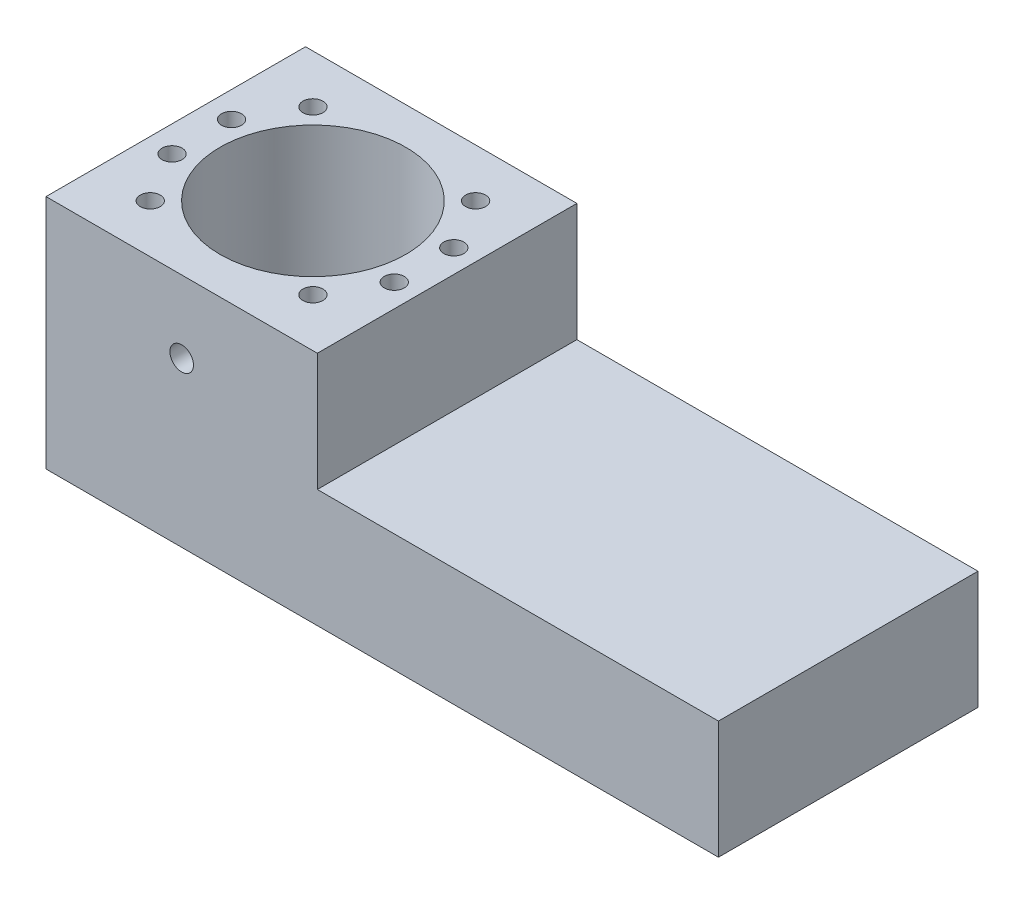
ISO-10303-21;
HEADER;
FILE_DESCRIPTION(('STEP AP214'),'2;1');
FILE_NAME('part.step','',(''),(''),'','','');
FILE_SCHEMA(('AUTOMOTIVE_DESIGN { 1 0 10303 214 1 1 1 1 }'));
ENDSEC;
DATA;
#1=APPLICATION_CONTEXT('core data for automotive mechanical design processes');
#2=APPLICATION_PROTOCOL_DEFINITION('international standard','automotive_design',2000,#1);
#3=PRODUCT_CONTEXT('',#1,'mechanical');
#4=PRODUCT('Part','Part','',(#3));
#5=PRODUCT_RELATED_PRODUCT_CATEGORY('part','',(#4));
#6=PRODUCT_DEFINITION_FORMATION('','',#4);
#7=PRODUCT_DEFINITION_CONTEXT('part definition',#1,'design');
#8=PRODUCT_DEFINITION('design','',#6,#7);
#9=PRODUCT_DEFINITION_SHAPE('','',#8);
#10=(LENGTH_UNIT() NAMED_UNIT(*) SI_UNIT(.MILLI.,.METRE.));
#11=(NAMED_UNIT(*) PLANE_ANGLE_UNIT() SI_UNIT($,.RADIAN.));
#12=(NAMED_UNIT(*) SI_UNIT($,.STERADIAN.) SOLID_ANGLE_UNIT());
#13=UNCERTAINTY_MEASURE_WITH_UNIT(LENGTH_MEASURE(1.E-05),#10,'distance_accuracy_value','');
#14=(GEOMETRIC_REPRESENTATION_CONTEXT(3) GLOBAL_UNCERTAINTY_ASSIGNED_CONTEXT((#13)) GLOBAL_UNIT_ASSIGNED_CONTEXT((#10,
#11,#12)) REPRESENTATION_CONTEXT('',''));
#15=CARTESIAN_POINT('',(0.,0.,0.));
#16=DIRECTION('',(0.,0.,1.));
#17=DIRECTION('',(1.,0.,0.));
#18=AXIS2_PLACEMENT_3D('',#15,#16,#17);
#19=CARTESIAN_POINT('',(0.,40.,0.));
#20=DIRECTION('',(0.,-1.,0.));
#21=DIRECTION('',(0.,0.,-1.));
#22=AXIS2_PLACEMENT_3D('',#19,#20,#21);
#23=PLANE('',#22);
#24=DIRECTION('',(0.,0.,-1.));
#25=VECTOR('',#24,1.);
#26=CARTESIAN_POINT('',(92.,40.,-88.));
#27=LINE('',#26,#25);
#28=CARTESIAN_POINT('',(92.,40.,0.));
#29=VERTEX_POINT('',#28);
#30=CARTESIAN_POINT('',(92.,40.,-88.));
#31=VERTEX_POINT('',#30);
#32=EDGE_CURVE('E69',#29,#31,#27,.T.);
#33=ORIENTED_EDGE('',*,*,#32,.F.);
#34=DIRECTION('',(1.,0.,0.));
#35=VECTOR('',#34,1.);
#36=CARTESIAN_POINT('',(0.,40.,0.));
#37=LINE('',#36,#35);
#38=CARTESIAN_POINT('',(228.,40.,0.));
#39=VERTEX_POINT('',#38);
#40=EDGE_CURVE('E107',#29,#39,#37,.T.);
#41=ORIENTED_EDGE('',*,*,#40,.T.);
#42=DIRECTION('',(0.,0.,-1.));
#43=VECTOR('',#42,1.);
#44=CARTESIAN_POINT('',(228.,40.,0.));
#45=LINE('',#44,#43);
#46=CARTESIAN_POINT('',(228.,40.,-88.));
#47=VERTEX_POINT('',#46);
#48=EDGE_CURVE('E75',#39,#47,#45,.T.);
#49=ORIENTED_EDGE('',*,*,#48,.T.);
#50=DIRECTION('',(-1.,0.,0.));
#51=VECTOR('',#50,1.);
#52=CARTESIAN_POINT('',(0.,40.,-88.));
#53=LINE('',#52,#51);
#54=EDGE_CURVE('E118',#47,#31,#53,.T.);
#55=ORIENTED_EDGE('',*,*,#54,.T.);
#56=EDGE_LOOP('',(#33,#41,#49,#55));
#57=FACE_BOUND('',#56,.T.);
#58=ADVANCED_FACE('F53',(#57),#23,.F.);
#59=CARTESIAN_POINT('',(0.,40.,0.));
#60=DIRECTION('',(1.,0.,0.));
#61=DIRECTION('',(0.,0.,-1.));
#62=AXIS2_PLACEMENT_3D('',#59,#60,#61);
#63=PLANE('',#62);
#64=DIRECTION('',(0.,0.,1.));
#65=VECTOR('',#64,1.);
#66=CARTESIAN_POINT('',(0.,0.,0.));
#67=LINE('',#66,#65);
#68=CARTESIAN_POINT('',(0.,0.,-88.));
#69=VERTEX_POINT('',#68);
#70=CARTESIAN_POINT('',(0.,0.,0.));
#71=VERTEX_POINT('',#70);
#72=EDGE_CURVE('E114',#69,#71,#67,.T.);
#73=ORIENTED_EDGE('',*,*,#72,.T.);
#74=DIRECTION('',(0.,-1.,0.));
#75=VECTOR('',#74,1.);
#76=CARTESIAN_POINT('',(0.,40.,0.));
#77=LINE('',#76,#75);
#78=CARTESIAN_POINT('',(0.,80.,0.));
#79=VERTEX_POINT('',#78);
#80=EDGE_CURVE('E11',#79,#71,#77,.T.);
#81=ORIENTED_EDGE('',*,*,#80,.F.);
#82=DIRECTION('',(0.,0.,1.));
#83=VECTOR('',#82,1.);
#84=CARTESIAN_POINT('',(0.,80.,-88.));
#85=LINE('',#84,#83);
#86=CARTESIAN_POINT('',(0.,80.,-88.));
#87=VERTEX_POINT('',#86);
#88=EDGE_CURVE('E116',#87,#79,#85,.T.);
#89=ORIENTED_EDGE('',*,*,#88,.F.);
#90=DIRECTION('',(0.,-1.,0.));
#91=VECTOR('',#90,1.);
#92=CARTESIAN_POINT('',(0.,40.,-88.));
#93=LINE('',#92,#91);
#94=EDGE_CURVE('E99',#87,#69,#93,.T.);
#95=ORIENTED_EDGE('',*,*,#94,.T.);
#96=EDGE_LOOP('',(#73,#81,#89,#95));
#97=FACE_BOUND('',#96,.T.);
#98=ADVANCED_FACE('F55',(#97),#63,.F.);
#99=CARTESIAN_POINT('',(0.,40.,0.));
#100=DIRECTION('',(0.,0.,-1.));
#101=DIRECTION('',(-1.,0.,0.));
#102=AXIS2_PLACEMENT_3D('',#99,#100,#101);
#103=PLANE('',#102);
#104=CARTESIAN_POINT('',(46.,55.4964910080931,0.));
#105=DIRECTION('',(0.,0.,1.));
#106=DIRECTION('',(1.,0.,0.));
#107=AXIS2_PLACEMENT_3D('',#104,#105,#106);
#108=CIRCLE('',#107,4.);
#109=CARTESIAN_POINT('',(50.,55.4964910080931,0.));
#110=VERTEX_POINT('',#109);
#111=EDGE_CURVE('E205',#110,#110,#108,.T.);
#112=ORIENTED_EDGE('',*,*,#111,.F.);
#113=EDGE_LOOP('',(#112));
#114=FACE_BOUND('',#113,.T.);
#115=DIRECTION('',(1.,0.,0.));
#116=VECTOR('',#115,1.);
#117=CARTESIAN_POINT('',(0.,0.,0.));
#118=LINE('',#117,#116);
#119=CARTESIAN_POINT('',(228.,0.,0.));
#120=VERTEX_POINT('',#119);
#121=EDGE_CURVE('E121',#71,#120,#118,.T.);
#122=ORIENTED_EDGE('',*,*,#121,.T.);
#123=DIRECTION('',(0.,-1.,0.));
#124=VECTOR('',#123,1.);
#125=CARTESIAN_POINT('',(228.,40.,0.));
#126=LINE('',#125,#124);
#127=EDGE_CURVE('E62',#39,#120,#126,.T.);
#128=ORIENTED_EDGE('',*,*,#127,.F.);
#129=ORIENTED_EDGE('',*,*,#40,.F.);
#130=DIRECTION('',(0.,-1.,0.));
#131=VECTOR('',#130,1.);
#132=CARTESIAN_POINT('',(92.,80.,0.));
#133=LINE('',#132,#131);
#134=CARTESIAN_POINT('',(92.,80.,0.));
#135=VERTEX_POINT('',#134);
#136=EDGE_CURVE('E123',#135,#29,#133,.T.);
#137=ORIENTED_EDGE('',*,*,#136,.F.);
#138=DIRECTION('',(1.,0.,0.));
#139=VECTOR('',#138,1.);
#140=CARTESIAN_POINT('',(0.,80.,0.));
#141=LINE('',#140,#139);
#142=EDGE_CURVE('E148',#79,#135,#141,.T.);
#143=ORIENTED_EDGE('',*,*,#142,.F.);
#144=ORIENTED_EDGE('',*,*,#80,.T.);
#145=EDGE_LOOP('',(#122,#128,#129,#137,#143,#144));
#146=FACE_BOUND('',#145,.T.);
#147=ADVANCED_FACE('F143',(#114,#146),#103,.F.);
#148=CARTESIAN_POINT('',(228.,40.,0.));
#149=DIRECTION('',(-1.,0.,0.));
#150=DIRECTION('',(0.,0.,1.));
#151=AXIS2_PLACEMENT_3D('',#148,#149,#150);
#152=PLANE('',#151);
#153=DIRECTION('',(0.,0.,-1.));
#154=VECTOR('',#153,1.);
#155=CARTESIAN_POINT('',(228.,0.,0.));
#156=LINE('',#155,#154);
#157=CARTESIAN_POINT('',(228.,0.,-88.));
#158=VERTEX_POINT('',#157);
#159=EDGE_CURVE('E108',#120,#158,#156,.T.);
#160=ORIENTED_EDGE('',*,*,#159,.T.);
#161=DIRECTION('',(0.,-1.,0.));
#162=VECTOR('',#161,1.);
#163=CARTESIAN_POINT('',(228.,40.,-88.));
#164=LINE('',#163,#162);
#165=EDGE_CURVE('E102',#47,#158,#164,.T.);
#166=ORIENTED_EDGE('',*,*,#165,.F.);
#167=ORIENTED_EDGE('',*,*,#48,.F.);
#168=ORIENTED_EDGE('',*,*,#127,.T.);
#169=EDGE_LOOP('',(#160,#166,#167,#168));
#170=FACE_BOUND('',#169,.T.);
#171=ADVANCED_FACE('F141',(#170),#152,.F.);
#172=CARTESIAN_POINT('',(0.,40.,-88.));
#173=DIRECTION('',(0.,0.,1.));
#174=DIRECTION('',(1.,0.,0.));
#175=AXIS2_PLACEMENT_3D('',#172,#173,#174);
#176=PLANE('',#175);
#177=DIRECTION('',(-1.,0.,0.));
#178=VECTOR('',#177,1.);
#179=CARTESIAN_POINT('',(0.,0.,-88.));
#180=LINE('',#179,#178);
#181=EDGE_CURVE('E95',#158,#69,#180,.T.);
#182=ORIENTED_EDGE('',*,*,#181,.T.);
#183=ORIENTED_EDGE('',*,*,#94,.F.);
#184=DIRECTION('',(-1.,0.,0.));
#185=VECTOR('',#184,1.);
#186=CARTESIAN_POINT('',(0.,80.,-88.));
#187=LINE('',#186,#185);
#188=CARTESIAN_POINT('',(92.,80.,-88.));
#189=VERTEX_POINT('',#188);
#190=EDGE_CURVE('E165',#189,#87,#187,.T.);
#191=ORIENTED_EDGE('',*,*,#190,.F.);
#192=DIRECTION('',(0.,-1.,0.));
#193=VECTOR('',#192,1.);
#194=CARTESIAN_POINT('',(92.,80.,-88.));
#195=LINE('',#194,#193);
#196=EDGE_CURVE('E129',#189,#31,#195,.T.);
#197=ORIENTED_EDGE('',*,*,#196,.T.);
#198=ORIENTED_EDGE('',*,*,#54,.F.);
#199=ORIENTED_EDGE('',*,*,#165,.T.);
#200=EDGE_LOOP('',(#182,#183,#191,#197,#198,#199));
#201=FACE_BOUND('',#200,.T.);
#202=ADVANCED_FACE('F97',(#201),#176,.F.);
#203=CARTESIAN_POINT('',(0.,0.,0.));
#204=DIRECTION('',(0.,-1.,0.));
#205=DIRECTION('',(0.,0.,-1.));
#206=AXIS2_PLACEMENT_3D('',#203,#204,#205);
#207=PLANE('',#206);
#208=CARTESIAN_POINT('',(46.5,0.,-44.));
#209=DIRECTION('',(0.,-1.,0.));
#210=DIRECTION('',(0.,0.,-1.));
#211=AXIS2_PLACEMENT_3D('',#208,#209,#210);
#212=CIRCLE('',#211,31.5);
#213=CARTESIAN_POINT('',(46.5,0.,-75.5));
#214=VERTEX_POINT('',#213);
#215=EDGE_CURVE('E283',#214,#214,#212,.F.);
#216=ORIENTED_EDGE('',*,*,#215,.T.);
#217=EDGE_LOOP('',(#216));
#218=FACE_BOUND('',#217,.T.);
#219=ORIENTED_EDGE('',*,*,#72,.F.);
#220=ORIENTED_EDGE('',*,*,#181,.F.);
#221=ORIENTED_EDGE('',*,*,#159,.F.);
#222=ORIENTED_EDGE('',*,*,#121,.F.);
#223=EDGE_LOOP('',(#219,#220,#221,#222));
#224=FACE_BOUND('',#223,.T.);
#225=ADVANCED_FACE('F120',(#218,#224),#207,.T.);
#226=CARTESIAN_POINT('',(92.,80.,-88.));
#227=DIRECTION('',(-1.,0.,0.));
#228=DIRECTION('',(0.,0.,1.));
#229=AXIS2_PLACEMENT_3D('',#226,#227,#228);
#230=PLANE('',#229);
#231=ORIENTED_EDGE('',*,*,#32,.T.);
#232=ORIENTED_EDGE('',*,*,#196,.F.);
#233=DIRECTION('',(0.,0.,-1.));
#234=VECTOR('',#233,1.);
#235=CARTESIAN_POINT('',(92.,80.,-88.));
#236=LINE('',#235,#234);
#237=EDGE_CURVE('E162',#135,#189,#236,.T.);
#238=ORIENTED_EDGE('',*,*,#237,.F.);
#239=ORIENTED_EDGE('',*,*,#136,.T.);
#240=EDGE_LOOP('',(#231,#232,#238,#239));
#241=FACE_BOUND('',#240,.T.);
#242=ADVANCED_FACE('F170',(#241),#230,.F.);
#243=CARTESIAN_POINT('',(0.,80.,0.));
#244=DIRECTION('',(0.,1.,0.));
#245=DIRECTION('',(0.,0.,1.));
#246=AXIS2_PLACEMENT_3D('',#243,#244,#245);
#247=PLANE('',#246);
#248=CARTESIAN_POINT('',(18.9228355337245,80.,-71.5771644662752));
#249=DIRECTION('',(0.,1.,0.));
#250=DIRECTION('',(0.,0.,1.));
#251=AXIS2_PLACEMENT_3D('',#248,#249,#250);
#252=CIRCLE('',#251,3.39999999999999);
#253=CARTESIAN_POINT('',(18.9228355337245,80.,-68.1771644662752));
#254=VERTEX_POINT('',#253);
#255=EDGE_CURVE('E208',#254,#254,#252,.T.);
#256=ORIENTED_EDGE('',*,*,#255,.F.);
#257=EDGE_LOOP('',(#256));
#258=FACE_BOUND('',#257,.T.);
#259=CARTESIAN_POINT('',(8.82889277472635,80.,-54.0939427589983));
#260=DIRECTION('',(0.,1.,0.));
#261=DIRECTION('',(0.,0.,1.));
#262=AXIS2_PLACEMENT_3D('',#259,#260,#261);
#263=CIRCLE('',#262,3.39999999999999);
#264=CARTESIAN_POINT('',(8.82889277472635,80.,-50.6939427589983));
#265=VERTEX_POINT('',#264);
#266=EDGE_CURVE('E227',#265,#265,#263,.T.);
#267=ORIENTED_EDGE('',*,*,#266,.F.);
#268=EDGE_LOOP('',(#267));
#269=FACE_BOUND('',#268,.T.);
#270=CARTESIAN_POINT('',(8.82889277472628,80.,-33.9060572410019));
#271=DIRECTION('',(0.,1.,0.));
#272=DIRECTION('',(0.,0.,1.));
#273=AXIS2_PLACEMENT_3D('',#270,#271,#272);
#274=CIRCLE('',#273,3.39999999999999);
#275=CARTESIAN_POINT('',(8.82889277472628,80.,-30.5060572410019));
#276=VERTEX_POINT('',#275);
#277=EDGE_CURVE('E235',#276,#276,#274,.T.);
#278=ORIENTED_EDGE('',*,*,#277,.F.);
#279=EDGE_LOOP('',(#278));
#280=FACE_BOUND('',#279,.T.);
#281=CARTESIAN_POINT('',(18.9228355337245,80.,-16.4228355337248));
#282=DIRECTION('',(0.,1.,0.));
#283=DIRECTION('',(0.,0.,1.));
#284=AXIS2_PLACEMENT_3D('',#281,#282,#283);
#285=CIRCLE('',#284,3.39999999999999);
#286=CARTESIAN_POINT('',(18.9228355337245,80.,-13.0228355337248));
#287=VERTEX_POINT('',#286);
#288=EDGE_CURVE('E243',#287,#287,#285,.T.);
#289=ORIENTED_EDGE('',*,*,#288,.F.);
#290=EDGE_LOOP('',(#289));
#291=FACE_BOUND('',#290,.T.);
#292=CARTESIAN_POINT('',(74.0771644662755,80.,-16.4228355337248));
#293=DIRECTION('',(0.,1.,0.));
#294=DIRECTION('',(0.,0.,1.));
#295=AXIS2_PLACEMENT_3D('',#292,#293,#294);
#296=CIRCLE('',#295,3.39999999999999);
#297=CARTESIAN_POINT('',(74.0771644662755,80.,-13.0228355337248));
#298=VERTEX_POINT('',#297);
#299=EDGE_CURVE('E251',#298,#298,#296,.T.);
#300=ORIENTED_EDGE('',*,*,#299,.F.);
#301=EDGE_LOOP('',(#300));
#302=FACE_BOUND('',#301,.T.);
#303=CARTESIAN_POINT('',(84.1711072252737,80.,-54.0939427589983));
#304=DIRECTION('',(0.,1.,0.));
#305=DIRECTION('',(0.,0.,1.));
#306=AXIS2_PLACEMENT_3D('',#303,#304,#305);
#307=CIRCLE('',#306,3.39999999999999);
#308=CARTESIAN_POINT('',(84.1711072252737,80.,-50.6939427589983));
#309=VERTEX_POINT('',#308);
#310=EDGE_CURVE('E259',#309,#309,#307,.T.);
#311=ORIENTED_EDGE('',*,*,#310,.F.);
#312=EDGE_LOOP('',(#311));
#313=FACE_BOUND('',#312,.T.);
#314=CARTESIAN_POINT('',(84.1711072252737,80.,-33.9060572410019));
#315=DIRECTION('',(0.,1.,0.));
#316=DIRECTION('',(0.,0.,1.));
#317=AXIS2_PLACEMENT_3D('',#314,#315,#316);
#318=CIRCLE('',#317,3.39999999999999);
#319=CARTESIAN_POINT('',(84.1711072252737,80.,-30.5060572410019));
#320=VERTEX_POINT('',#319);
#321=EDGE_CURVE('E267',#320,#320,#318,.T.);
#322=ORIENTED_EDGE('',*,*,#321,.F.);
#323=EDGE_LOOP('',(#322));
#324=FACE_BOUND('',#323,.T.);
#325=CARTESIAN_POINT('',(74.0771644662755,80.,-71.5771644662752));
#326=DIRECTION('',(0.,1.,0.));
#327=DIRECTION('',(0.,0.,1.));
#328=AXIS2_PLACEMENT_3D('',#325,#326,#327);
#329=CIRCLE('',#328,3.39999999999999);
#330=CARTESIAN_POINT('',(74.0771644662755,80.,-68.1771644662752));
#331=VERTEX_POINT('',#330);
#332=EDGE_CURVE('E275',#331,#331,#329,.T.);
#333=ORIENTED_EDGE('',*,*,#332,.F.);
#334=EDGE_LOOP('',(#333));
#335=FACE_BOUND('',#334,.T.);
#336=CARTESIAN_POINT('',(46.5,80.,-44.));
#337=DIRECTION('',(0.,1.,0.));
#338=DIRECTION('',(0.,0.,1.));
#339=AXIS2_PLACEMENT_3D('',#336,#337,#338);
#340=CIRCLE('',#339,31.5);
#341=CARTESIAN_POINT('',(46.5,80.,-12.5));
#342=VERTEX_POINT('',#341);
#343=EDGE_CURVE('E178',#342,#342,#340,.T.);
#344=ORIENTED_EDGE('',*,*,#343,.F.);
#345=EDGE_LOOP('',(#344));
#346=FACE_BOUND('',#345,.T.);
#347=ORIENTED_EDGE('',*,*,#88,.T.);
#348=ORIENTED_EDGE('',*,*,#142,.T.);
#349=ORIENTED_EDGE('',*,*,#237,.T.);
#350=ORIENTED_EDGE('',*,*,#190,.T.);
#351=EDGE_LOOP('',(#347,#348,#349,#350));
#352=FACE_BOUND('',#351,.T.);
#353=ADVANCED_FACE('F164',(#258,#269,#280,#291,#302,#313,#324,#335,#346,#352),#247,.T.);
#354=CARTESIAN_POINT('',(46.5,-0.001000000000001,-44.));
#355=DIRECTION('',(0.,1.,0.));
#356=DIRECTION('',(0.,0.,1.));
#357=AXIS2_PLACEMENT_3D('',#354,#355,#356);
#358=CYLINDRICAL_SURFACE('',#357,31.5);
#359=CARTESIAN_POINT('',(50.,55.4964910080931,-12.6950483150029));
#360=CARTESIAN_POINT('',(49.9999905526214,55.2725134643701,-12.6950452182688));
#361=CARTESIAN_POINT('',(49.9811249309432,55.0483968328891,-12.6929201998589));
#362=CARTESIAN_POINT('',(49.9061589237522,54.6063947805882,-12.6846770916041));
#363=CARTESIAN_POINT('',(49.8500198619527,54.3885160776873,-12.6785548542082));
#364=CARTESIAN_POINT('',(49.7021698560303,53.9654451910184,-12.6630952637477));
#365=CARTESIAN_POINT('',(49.610481283404,53.7602451224871,-12.6537599331138));
#366=CARTESIAN_POINT('',(49.3941736577313,53.3681788137096,-12.6330507119794));
#367=CARTESIAN_POINT('',(49.2695603817368,53.1813093650064,-12.6216771792195));
#368=CARTESIAN_POINT('',(48.9903258728378,52.8303249548772,-12.5982814346249));
#369=CARTESIAN_POINT('',(48.835585421737,52.66630498827,-12.5862567873782));
#370=CARTESIAN_POINT('',(48.5007394484845,52.3665061512053,-12.5631562093556));
#371=CARTESIAN_POINT('',(48.3206329056692,52.2307284176843,-12.5520803167839));
#372=CARTESIAN_POINT('',(47.9397484491421,51.9910534936037,-12.5323420149));
#373=CARTESIAN_POINT('',(47.7389342327172,51.8872136071653,-12.5236839462729));
#374=CARTESIAN_POINT('',(47.3225949024218,51.7147576963311,-12.5100544715113));
#375=CARTESIAN_POINT('',(47.1070703932273,51.6461402250822,-12.50508291394));
#376=CARTESIAN_POINT('',(46.6687176640996,51.546420113928,-12.4996938176341));
#377=CARTESIAN_POINT('',(46.4459367547901,51.5151108636889,-12.4992510939941));
#378=CARTESIAN_POINT('',(45.998324678323,51.4902161912952,-12.5032001072926));
#379=CARTESIAN_POINT('',(45.7734935767528,51.4966295665601,-12.5075916901118));
#380=CARTESIAN_POINT('',(45.32916739846,51.5468377754367,-12.5209853836314));
#381=CARTESIAN_POINT('',(45.1096536462226,51.5904729827294,-12.5299677408946));
#382=CARTESIAN_POINT('',(44.6811289572067,51.7135976348924,-12.551824054253));
#383=CARTESIAN_POINT('',(44.472118339847,51.7930881694537,-12.5646981286187));
#384=CARTESIAN_POINT('',(44.0694674156033,51.9860618590479,-12.5932574770662));
#385=CARTESIAN_POINT('',(43.8759011686966,52.0996976457437,-12.6089552440715));
#386=CARTESIAN_POINT('',(43.510517746574,52.3576229980031,-12.6416407155006));
#387=CARTESIAN_POINT('',(43.3387017055665,52.5019141611031,-12.6586284871205));
#388=CARTESIAN_POINT('',(43.0203495091137,52.8183524958156,-12.6923667203972));
#389=CARTESIAN_POINT('',(42.8740120663182,52.9906999626945,-12.7091144563983));
#390=CARTESIAN_POINT('',(42.612334359207,53.3576811974703,-12.7405457363362));
#391=CARTESIAN_POINT('',(42.4969939694182,53.55231487515,-12.7552292886283));
#392=CARTESIAN_POINT('',(42.3007400042504,53.9582306179323,-12.780998555443));
#393=CARTESIAN_POINT('',(42.2197941324777,54.1694968431189,-12.7920876428308));
#394=CARTESIAN_POINT('',(42.0945929746721,54.6028198533479,-12.8095139100407));
#395=CARTESIAN_POINT('',(42.0503353663374,54.8248759544682,-12.8158513906286));
#396=CARTESIAN_POINT('',(42.000084509239,55.2713452884554,-12.8230628630101));
#397=CARTESIAN_POINT('',(41.9937521613076,55.4957196076113,-12.8239852708361));
#398=CARTESIAN_POINT('',(42.0186375718385,55.9423267016635,-12.8203986083807));
#399=CARTESIAN_POINT('',(42.0498542963398,56.1645595353584,-12.8158896876576));
#400=CARTESIAN_POINT('',(42.1486808725387,56.5996218858442,-12.8019476603474));
#401=CARTESIAN_POINT('',(42.2161370100331,56.8124870405947,-12.7925353571688));
#402=CARTESIAN_POINT('',(42.3853634876833,57.2238820878671,-12.7697740531702));
#403=CARTESIAN_POINT('',(42.4871352575761,57.4224113826768,-12.7564248883263));
#404=CARTESIAN_POINT('',(42.7228817907666,57.8009528511829,-12.7270479725938));
#405=CARTESIAN_POINT('',(42.8570663285344,57.9808330207146,-12.7110029892939));
#406=CARTESIAN_POINT('',(43.1535204604882,58.3156317557635,-12.6779109077624));
#407=CARTESIAN_POINT('',(43.3157915191141,58.4705490188934,-12.6608637573081));
#408=CARTESIAN_POINT('',(43.6653358729297,58.7522741506609,-12.627309818171));
#409=CARTESIAN_POINT('',(43.852796592093,58.8788502408813,-12.6108083634729));
#410=CARTESIAN_POINT('',(44.2464898023805,59.0987171866047,-12.5800919281779));
#411=CARTESIAN_POINT('',(44.4527220539545,59.1920084667922,-12.5658769184092));
#412=CARTESIAN_POINT('',(44.8777762559714,59.3424429616687,-12.5410808779646));
#413=CARTESIAN_POINT('',(45.0965752887391,59.3996498333628,-12.5304934629615));
#414=CARTESIAN_POINT('',(45.5408439035196,59.4764390286685,-12.513822028548));
#415=CARTESIAN_POINT('',(45.7663131437518,59.4960232766797,-12.5077377788103));
#416=CARTESIAN_POINT('',(46.215621059676,59.4969385368491,-12.5004885908913));
#417=CARTESIAN_POINT('',(46.4394585432951,59.4785705665454,-12.4992851648802));
#418=CARTESIAN_POINT('',(46.8808921563182,59.4047013068041,-12.5015293210905));
#419=CARTESIAN_POINT('',(47.0984883591206,59.3492004542421,-12.5049768485929));
#420=CARTESIAN_POINT('',(47.5207863101442,59.2028423791761,-12.515836513415));
#421=CARTESIAN_POINT('',(47.7255157498168,59.1120643338178,-12.5232397862013));
#422=CARTESIAN_POINT('',(48.1168962068975,58.8977453384345,-12.54091435239));
#423=CARTESIAN_POINT('',(48.3035471301131,58.7742042177199,-12.5511856607344));
#424=CARTESIAN_POINT('',(48.6546071693469,58.4970504531657,-12.57327842807));
#425=CARTESIAN_POINT('',(48.8188856727676,58.343273041252,-12.5851082578919));
#426=CARTESIAN_POINT('',(49.1194256460127,58.010348739124,-12.6087369374011));
#427=CARTESIAN_POINT('',(49.2556804379094,57.8311958191728,-12.6205357790442));
#428=CARTESIAN_POINT('',(49.496856535434,57.4516866182564,-12.6426463297995));
#429=CARTESIAN_POINT('',(49.6016320377496,57.2512373215034,-12.652951007871));
#430=CARTESIAN_POINT('',(49.7759057910828,56.8355992086745,-12.6706817467005));
#431=CARTESIAN_POINT('',(49.8454417195595,56.6204264153435,-12.6781108799175));
#432=CARTESIAN_POINT('',(49.9307813948671,56.252889382183,-12.6873687861393));
#433=CARTESIAN_POINT('',(49.9567012698074,56.1028210919076,-12.690232784254));
#434=CARTESIAN_POINT('',(49.9913137285959,55.8006869179542,-12.6940735946492));
#435=CARTESIAN_POINT('',(50.000006416849,55.6486210463881,-12.6950504183668));
#436=CARTESIAN_POINT('',(50.,55.4964910080931,-12.6950483150029));
#437=B_SPLINE_CURVE_WITH_KNOTS('',3,(#359,#360,#361,#362,#363,#364,#365,#366,#367,#368,#369,
#370,#371,#372,#373,#374,#375,#376,#377,#378,#379,#380,#381,#382,#383,#384,#385,#386,#387,#388,
#389,#390,#391,#392,#393,#394,#395,#396,#397,#398,#399,#400,#401,#402,#403,#404,#405,#406,#407,
#408,#409,#410,#411,#412,#413,#414,#415,#416,#417,#418,#419,#420,#421,#422,#423,#424,#425,#426,
#427,#428,#429,#430,#431,#432,#433,#434,#435,#436),.UNSPECIFIED.,.T.,.F.,(4,2,2,2,2,2,2,2,2,2,2,
2,2,2,2,2,2,2,2,2,2,2,2,2,2,2,2,2,2,2,2,2,2,2,2,2,2,2,4),(0.,0.671377595071049,1.34345292714408,
2.01510600331093,2.6866413076985,3.36089007639694,4.03516598281296,4.71064473700618,
5.38609574191924,6.05778849924319,6.72945984341711,7.39826511454233,8.06709071291595,
8.73895164559038,9.41084759938919,10.0877694779732,10.7646886164019,11.4409707166747,
12.1172100062243,12.7873937365306,13.4575590129077,14.1249038834842,14.792276561958,
15.4640899765285,16.1359384302175,16.8130954939901,17.4902439175317,18.1661944084293,
18.8421103234923,19.5126858040352,20.1832533952639,20.8523245577611,21.5213992060655,
22.1942263118651,22.8672135641258,23.5432714848814,24.218605044709,24.6746209316293,
25.1306340548687),.UNSPECIFIED.);
#438=CARTESIAN_POINT('',(50.,55.4964910080931,-12.6950483150029));
#439=VERTEX_POINT('',#438);
#440=EDGE_CURVE('E209',#439,#439,#437,.T.);
#441=ORIENTED_EDGE('',*,*,#440,.F.);
#442=EDGE_LOOP('',(#441));
#443=FACE_BOUND('',#442,.T.);
#444=ORIENTED_EDGE('',*,*,#215,.F.);
#445=EDGE_LOOP('',(#444));
#446=FACE_BOUND('',#445,.T.);
#447=ORIENTED_EDGE('',*,*,#343,.T.);
#448=EDGE_LOOP('',(#447));
#449=FACE_BOUND('',#448,.T.);
#450=ADVANCED_FACE('F294',(#443,#446,#449),#358,.F.);
#451=CARTESIAN_POINT('',(74.0771644662755,50.,-71.5771644662752));
#452=DIRECTION('',(0.,1.,0.));
#453=DIRECTION('',(0.,0.,1.));
#454=AXIS2_PLACEMENT_3D('',#451,#452,#453);
#455=CONICAL_SURFACE('',#454,3.4,1.02974425867665);
#456=CARTESIAN_POINT('',(74.0771644662755,47.9570738953063,-71.5771644662752));
#457=VERTEX_POINT('',#456);
#458=VERTEX_LOOP('',#457);
#459=FACE_BOUND('',#458,.T.);
#460=CARTESIAN_POINT('',(74.0771644662755,50.,-71.5771644662752));
#461=DIRECTION('',(0.,1.,0.));
#462=DIRECTION('',(0.,0.,1.));
#463=AXIS2_PLACEMENT_3D('',#460,#461,#462);
#464=CIRCLE('',#463,3.4);
#465=CARTESIAN_POINT('',(74.0771644662755,50.,-68.1771644662752));
#466=VERTEX_POINT('',#465);
#467=EDGE_CURVE('E279',#466,#466,#464,.T.);
#468=ORIENTED_EDGE('',*,*,#467,.T.);
#469=EDGE_LOOP('',(#468));
#470=FACE_BOUND('',#469,.T.);
#471=ADVANCED_FACE('F296',(#459,#470),#455,.F.);
#472=CARTESIAN_POINT('',(74.0771644662755,80.,-71.5771644662752));
#473=DIRECTION('',(0.,1.,0.));
#474=DIRECTION('',(0.,0.,1.));
#475=AXIS2_PLACEMENT_3D('',#472,#473,#474);
#476=CYLINDRICAL_SURFACE('',#475,3.39999999999999);
#477=ORIENTED_EDGE('',*,*,#467,.F.);
#478=EDGE_LOOP('',(#477));
#479=FACE_BOUND('',#478,.T.);
#480=ORIENTED_EDGE('',*,*,#332,.T.);
#481=EDGE_LOOP('',(#480));
#482=FACE_BOUND('',#481,.T.);
#483=ADVANCED_FACE('F311',(#479,#482),#476,.F.);
#484=CARTESIAN_POINT('',(84.1711072252737,50.,-33.9060572410019));
#485=DIRECTION('',(0.,1.,0.));
#486=DIRECTION('',(0.,0.,1.));
#487=AXIS2_PLACEMENT_3D('',#484,#485,#486);
#488=CONICAL_SURFACE('',#487,3.4,1.02974425867665);
#489=CARTESIAN_POINT('',(84.1711072252737,47.9570738953063,-33.9060572410019));
#490=VERTEX_POINT('',#489);
#491=VERTEX_LOOP('',#490);
#492=FACE_BOUND('',#491,.T.);
#493=CARTESIAN_POINT('',(84.1711072252737,50.,-33.9060572410019));
#494=DIRECTION('',(0.,1.,0.));
#495=DIRECTION('',(0.,0.,1.));
#496=AXIS2_PLACEMENT_3D('',#493,#494,#495);
#497=CIRCLE('',#496,3.4);
#498=CARTESIAN_POINT('',(84.1711072252737,50.,-30.5060572410019));
#499=VERTEX_POINT('',#498);
#500=EDGE_CURVE('E271',#499,#499,#497,.T.);
#501=ORIENTED_EDGE('',*,*,#500,.T.);
#502=EDGE_LOOP('',(#501));
#503=FACE_BOUND('',#502,.T.);
#504=ADVANCED_FACE('F315',(#492,#503),#488,.F.);
#505=CARTESIAN_POINT('',(84.1711072252737,80.,-33.9060572410019));
#506=DIRECTION('',(0.,1.,0.));
#507=DIRECTION('',(0.,0.,1.));
#508=AXIS2_PLACEMENT_3D('',#505,#506,#507);
#509=CYLINDRICAL_SURFACE('',#508,3.39999999999999);
#510=ORIENTED_EDGE('',*,*,#500,.F.);
#511=EDGE_LOOP('',(#510));
#512=FACE_BOUND('',#511,.T.);
#513=ORIENTED_EDGE('',*,*,#321,.T.);
#514=EDGE_LOOP('',(#513));
#515=FACE_BOUND('',#514,.T.);
#516=ADVANCED_FACE('F319',(#512,#515),#509,.F.);
#517=CARTESIAN_POINT('',(84.1711072252737,50.,-54.0939427589983));
#518=DIRECTION('',(0.,1.,0.));
#519=DIRECTION('',(0.,0.,1.));
#520=AXIS2_PLACEMENT_3D('',#517,#518,#519);
#521=CONICAL_SURFACE('',#520,3.39999999999999,1.02974425867665);
#522=CARTESIAN_POINT('',(84.1711072252736,47.9570738953063,-54.0939427589983));
#523=VERTEX_POINT('',#522);
#524=VERTEX_LOOP('',#523);
#525=FACE_BOUND('',#524,.T.);
#526=CARTESIAN_POINT('',(84.1711072252737,50.,-54.0939427589983));
#527=DIRECTION('',(0.,1.,0.));
#528=DIRECTION('',(0.,0.,1.));
#529=AXIS2_PLACEMENT_3D('',#526,#527,#528);
#530=CIRCLE('',#529,3.39999999999999);
#531=CARTESIAN_POINT('',(84.1711072252737,50.,-50.6939427589983));
#532=VERTEX_POINT('',#531);
#533=EDGE_CURVE('E263',#532,#532,#530,.T.);
#534=ORIENTED_EDGE('',*,*,#533,.T.);
#535=EDGE_LOOP('',(#534));
#536=FACE_BOUND('',#535,.T.);
#537=ADVANCED_FACE('F323',(#525,#536),#521,.F.);
#538=CARTESIAN_POINT('',(84.1711072252737,80.,-54.0939427589983));
#539=DIRECTION('',(0.,1.,0.));
#540=DIRECTION('',(0.,0.,1.));
#541=AXIS2_PLACEMENT_3D('',#538,#539,#540);
#542=CYLINDRICAL_SURFACE('',#541,3.39999999999999);
#543=ORIENTED_EDGE('',*,*,#533,.F.);
#544=EDGE_LOOP('',(#543));
#545=FACE_BOUND('',#544,.T.);
#546=ORIENTED_EDGE('',*,*,#310,.T.);
#547=EDGE_LOOP('',(#546));
#548=FACE_BOUND('',#547,.T.);
#549=ADVANCED_FACE('F327',(#545,#548),#542,.F.);
#550=CARTESIAN_POINT('',(74.0771644662755,50.,-16.4228355337248));
#551=DIRECTION('',(0.,1.,0.));
#552=DIRECTION('',(0.,0.,1.));
#553=AXIS2_PLACEMENT_3D('',#550,#551,#552);
#554=CONICAL_SURFACE('',#553,3.39999999999999,1.02974425867665);
#555=CARTESIAN_POINT('',(74.0771644662755,47.9570738953063,-16.4228355337248));
#556=VERTEX_POINT('',#555);
#557=VERTEX_LOOP('',#556);
#558=FACE_BOUND('',#557,.T.);
#559=CARTESIAN_POINT('',(74.0771644662755,50.,-16.4228355337248));
#560=DIRECTION('',(0.,1.,0.));
#561=DIRECTION('',(0.,0.,1.));
#562=AXIS2_PLACEMENT_3D('',#559,#560,#561);
#563=CIRCLE('',#562,3.39999999999999);
#564=CARTESIAN_POINT('',(74.0771644662755,50.,-13.0228355337248));
#565=VERTEX_POINT('',#564);
#566=EDGE_CURVE('E255',#565,#565,#563,.T.);
#567=ORIENTED_EDGE('',*,*,#566,.T.);
#568=EDGE_LOOP('',(#567));
#569=FACE_BOUND('',#568,.T.);
#570=ADVANCED_FACE('F331',(#558,#569),#554,.F.);
#571=CARTESIAN_POINT('',(74.0771644662755,80.,-16.4228355337248));
#572=DIRECTION('',(0.,1.,0.));
#573=DIRECTION('',(0.,0.,1.));
#574=AXIS2_PLACEMENT_3D('',#571,#572,#573);
#575=CYLINDRICAL_SURFACE('',#574,3.39999999999999);
#576=ORIENTED_EDGE('',*,*,#566,.F.);
#577=EDGE_LOOP('',(#576));
#578=FACE_BOUND('',#577,.T.);
#579=ORIENTED_EDGE('',*,*,#299,.T.);
#580=EDGE_LOOP('',(#579));
#581=FACE_BOUND('',#580,.T.);
#582=ADVANCED_FACE('F335',(#578,#581),#575,.F.);
#583=CARTESIAN_POINT('',(18.9228355337245,50.,-16.4228355337248));
#584=DIRECTION('',(0.,1.,0.));
#585=DIRECTION('',(0.,0.,1.));
#586=AXIS2_PLACEMENT_3D('',#583,#584,#585);
#587=CONICAL_SURFACE('',#586,3.39999999999999,1.02974425867665);
#588=CARTESIAN_POINT('',(18.9228355337245,47.9570738953063,-16.4228355337248));
#589=VERTEX_POINT('',#588);
#590=VERTEX_LOOP('',#589);
#591=FACE_BOUND('',#590,.T.);
#592=CARTESIAN_POINT('',(18.9228355337245,50.,-16.4228355337248));
#593=DIRECTION('',(0.,1.,0.));
#594=DIRECTION('',(0.,0.,1.));
#595=AXIS2_PLACEMENT_3D('',#592,#593,#594);
#596=CIRCLE('',#595,3.39999999999999);
#597=CARTESIAN_POINT('',(18.9228355337245,50.,-13.0228355337248));
#598=VERTEX_POINT('',#597);
#599=EDGE_CURVE('E247',#598,#598,#596,.T.);
#600=ORIENTED_EDGE('',*,*,#599,.T.);
#601=EDGE_LOOP('',(#600));
#602=FACE_BOUND('',#601,.T.);
#603=ADVANCED_FACE('F339',(#591,#602),#587,.F.);
#604=CARTESIAN_POINT('',(18.9228355337245,80.,-16.4228355337248));
#605=DIRECTION('',(0.,1.,0.));
#606=DIRECTION('',(0.,0.,1.));
#607=AXIS2_PLACEMENT_3D('',#604,#605,#606);
#608=CYLINDRICAL_SURFACE('',#607,3.39999999999999);
#609=ORIENTED_EDGE('',*,*,#599,.F.);
#610=EDGE_LOOP('',(#609));
#611=FACE_BOUND('',#610,.T.);
#612=ORIENTED_EDGE('',*,*,#288,.T.);
#613=EDGE_LOOP('',(#612));
#614=FACE_BOUND('',#613,.T.);
#615=ADVANCED_FACE('F343',(#611,#614),#608,.F.);
#616=CARTESIAN_POINT('',(8.82889277472628,50.,-33.9060572410019));
#617=DIRECTION('',(0.,1.,0.));
#618=DIRECTION('',(0.,0.,1.));
#619=AXIS2_PLACEMENT_3D('',#616,#617,#618);
#620=CONICAL_SURFACE('',#619,3.39999999999999,1.02974425867665);
#621=CARTESIAN_POINT('',(8.82889277472627,47.9570738953063,-33.9060572410019));
#622=VERTEX_POINT('',#621);
#623=VERTEX_LOOP('',#622);
#624=FACE_BOUND('',#623,.T.);
#625=CARTESIAN_POINT('',(8.82889277472628,50.,-33.9060572410019));
#626=DIRECTION('',(0.,1.,0.));
#627=DIRECTION('',(0.,0.,1.));
#628=AXIS2_PLACEMENT_3D('',#625,#626,#627);
#629=CIRCLE('',#628,3.39999999999999);
#630=CARTESIAN_POINT('',(8.82889277472628,50.,-30.5060572410019));
#631=VERTEX_POINT('',#630);
#632=EDGE_CURVE('E239',#631,#631,#629,.T.);
#633=ORIENTED_EDGE('',*,*,#632,.T.);
#634=EDGE_LOOP('',(#633));
#635=FACE_BOUND('',#634,.T.);
#636=ADVANCED_FACE('F347',(#624,#635),#620,.F.);
#637=CARTESIAN_POINT('',(8.82889277472628,80.,-33.9060572410019));
#638=DIRECTION('',(0.,1.,0.));
#639=DIRECTION('',(0.,0.,1.));
#640=AXIS2_PLACEMENT_3D('',#637,#638,#639);
#641=CYLINDRICAL_SURFACE('',#640,3.39999999999999);
#642=ORIENTED_EDGE('',*,*,#632,.F.);
#643=EDGE_LOOP('',(#642));
#644=FACE_BOUND('',#643,.T.);
#645=ORIENTED_EDGE('',*,*,#277,.T.);
#646=EDGE_LOOP('',(#645));
#647=FACE_BOUND('',#646,.T.);
#648=ADVANCED_FACE('F351',(#644,#647),#641,.F.);
#649=CARTESIAN_POINT('',(8.82889277472635,50.,-54.0939427589983));
#650=DIRECTION('',(0.,1.,0.));
#651=DIRECTION('',(0.,0.,1.));
#652=AXIS2_PLACEMENT_3D('',#649,#650,#651);
#653=CONICAL_SURFACE('',#652,3.39999999999999,1.02974425867665);
#654=CARTESIAN_POINT('',(8.82889277472634,47.9570738953063,-54.0939427589983));
#655=VERTEX_POINT('',#654);
#656=VERTEX_LOOP('',#655);
#657=FACE_BOUND('',#656,.T.);
#658=CARTESIAN_POINT('',(8.82889277472635,50.,-54.0939427589983));
#659=DIRECTION('',(0.,1.,0.));
#660=DIRECTION('',(0.,0.,1.));
#661=AXIS2_PLACEMENT_3D('',#658,#659,#660);
#662=CIRCLE('',#661,3.39999999999999);
#663=CARTESIAN_POINT('',(8.82889277472635,50.,-50.6939427589983));
#664=VERTEX_POINT('',#663);
#665=EDGE_CURVE('E231',#664,#664,#662,.T.);
#666=ORIENTED_EDGE('',*,*,#665,.T.);
#667=EDGE_LOOP('',(#666));
#668=FACE_BOUND('',#667,.T.);
#669=ADVANCED_FACE('F355',(#657,#668),#653,.F.);
#670=CARTESIAN_POINT('',(8.82889277472635,80.,-54.0939427589983));
#671=DIRECTION('',(0.,1.,0.));
#672=DIRECTION('',(0.,0.,1.));
#673=AXIS2_PLACEMENT_3D('',#670,#671,#672);
#674=CYLINDRICAL_SURFACE('',#673,3.39999999999999);
#675=ORIENTED_EDGE('',*,*,#665,.F.);
#676=EDGE_LOOP('',(#675));
#677=FACE_BOUND('',#676,.T.);
#678=ORIENTED_EDGE('',*,*,#266,.T.);
#679=EDGE_LOOP('',(#678));
#680=FACE_BOUND('',#679,.T.);
#681=ADVANCED_FACE('F359',(#677,#680),#674,.F.);
#682=CARTESIAN_POINT('',(18.9228355337245,50.,-71.5771644662752));
#683=DIRECTION('',(0.,1.,0.));
#684=DIRECTION('',(0.,0.,1.));
#685=AXIS2_PLACEMENT_3D('',#682,#683,#684);
#686=CONICAL_SURFACE('',#685,3.39999999999999,1.02974425867665);
#687=CARTESIAN_POINT('',(18.9228355337245,47.9570738953063,-71.5771644662752));
#688=VERTEX_POINT('',#687);
#689=VERTEX_LOOP('',#688);
#690=FACE_BOUND('',#689,.T.);
#691=CARTESIAN_POINT('',(18.9228355337245,50.,-71.5771644662752));
#692=DIRECTION('',(0.,1.,0.));
#693=DIRECTION('',(0.,0.,1.));
#694=AXIS2_PLACEMENT_3D('',#691,#692,#693);
#695=CIRCLE('',#694,3.39999999999999);
#696=CARTESIAN_POINT('',(18.9228355337245,50.,-68.1771644662752));
#697=VERTEX_POINT('',#696);
#698=EDGE_CURVE('E214',#697,#697,#695,.T.);
#699=ORIENTED_EDGE('',*,*,#698,.T.);
#700=EDGE_LOOP('',(#699));
#701=FACE_BOUND('',#700,.T.);
#702=ADVANCED_FACE('F363',(#690,#701),#686,.F.);
#703=CARTESIAN_POINT('',(18.9228355337245,80.,-71.5771644662752));
#704=DIRECTION('',(0.,1.,0.));
#705=DIRECTION('',(0.,0.,1.));
#706=AXIS2_PLACEMENT_3D('',#703,#704,#705);
#707=CYLINDRICAL_SURFACE('',#706,3.39999999999999);
#708=ORIENTED_EDGE('',*,*,#698,.F.);
#709=EDGE_LOOP('',(#708));
#710=FACE_BOUND('',#709,.T.);
#711=ORIENTED_EDGE('',*,*,#255,.T.);
#712=EDGE_LOOP('',(#711));
#713=FACE_BOUND('',#712,.T.);
#714=ADVANCED_FACE('F367',(#710,#713),#707,.F.);
#715=CARTESIAN_POINT('',(46.,55.4964910080931,-88.001));
#716=DIRECTION('',(0.,0.,1.));
#717=DIRECTION('',(1.,0.,0.));
#718=AXIS2_PLACEMENT_3D('',#715,#716,#717);
#719=CYLINDRICAL_SURFACE('',#718,4.);
#720=ORIENTED_EDGE('',*,*,#111,.T.);
#721=EDGE_LOOP('',(#720));
#722=FACE_BOUND('',#721,.T.);
#723=ORIENTED_EDGE('',*,*,#440,.T.);
#724=EDGE_LOOP('',(#723));
#725=FACE_BOUND('',#724,.T.);
#726=ADVANCED_FACE('F370',(#722,#725),#719,.F.);
#727=CLOSED_SHELL('',(#58,#98,#147,#171,#202,#225,#242,#353,#450,#471,#483,#504,#516,#537,#549,
#570,#582,#603,#615,#636,#648,#669,#681,#702,#714,#726));
#728=MANIFOLD_SOLID_BREP('B2',#727);
#729=ADVANCED_BREP_SHAPE_REPRESENTATION('',(#18,#728),#14);
#730=SHAPE_DEFINITION_REPRESENTATION(#9,#729);
ENDSEC;
END-ISO-10303-21;
